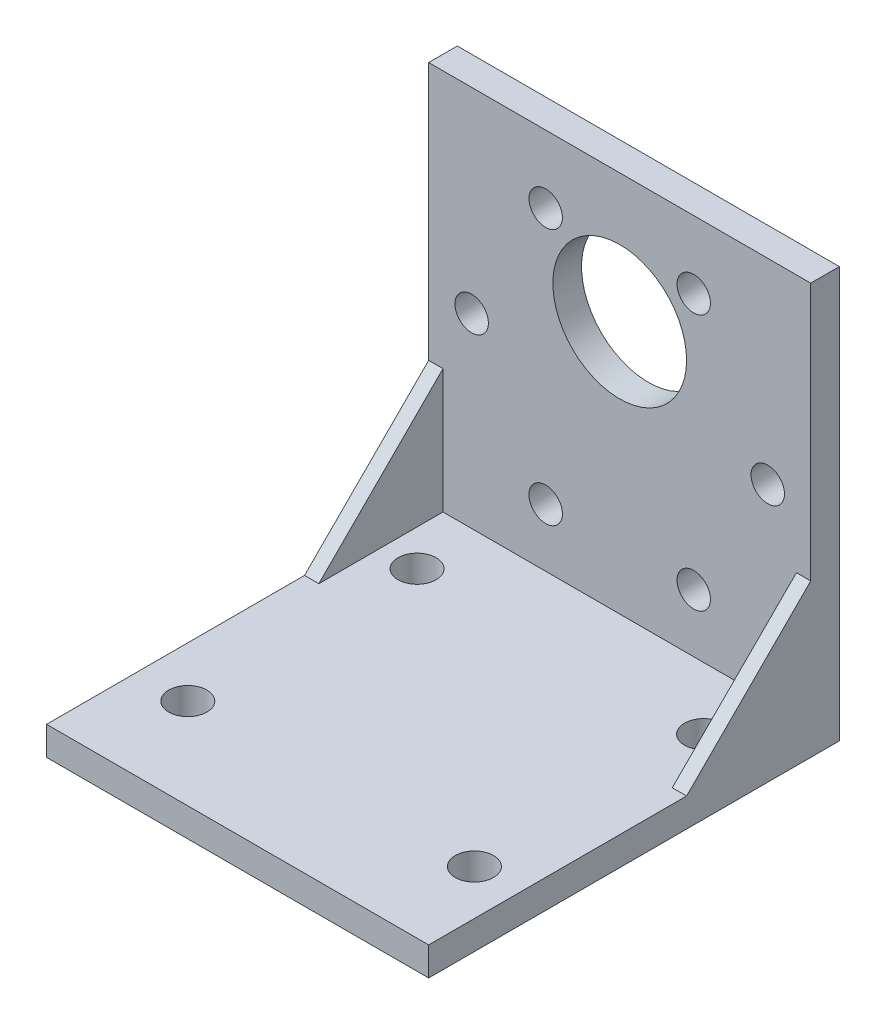
ISO-10303-21;
HEADER;
FILE_DESCRIPTION(('STEP AP214'),'2;1');
FILE_NAME('part.step','',(''),(''),'','','');
FILE_SCHEMA(('AUTOMOTIVE_DESIGN { 1 0 10303 214 1 1 1 1 }'));
ENDSEC;
DATA;
#1=APPLICATION_CONTEXT('core data for automotive mechanical design processes');
#2=APPLICATION_PROTOCOL_DEFINITION('international standard','automotive_design',2000,#1);
#3=PRODUCT_CONTEXT('',#1,'mechanical');
#4=PRODUCT('Part','Part','',(#3));
#5=PRODUCT_RELATED_PRODUCT_CATEGORY('part','',(#4));
#6=PRODUCT_DEFINITION_FORMATION('','',#4);
#7=PRODUCT_DEFINITION_CONTEXT('part definition',#1,'design');
#8=PRODUCT_DEFINITION('design','',#6,#7);
#9=PRODUCT_DEFINITION_SHAPE('','',#8);
#10=(LENGTH_UNIT() NAMED_UNIT(*) SI_UNIT(.MILLI.,.METRE.));
#11=(NAMED_UNIT(*) PLANE_ANGLE_UNIT() SI_UNIT($,.RADIAN.));
#12=(NAMED_UNIT(*) SI_UNIT($,.STERADIAN.) SOLID_ANGLE_UNIT());
#13=UNCERTAINTY_MEASURE_WITH_UNIT(LENGTH_MEASURE(1.E-05),#10,'distance_accuracy_value','');
#14=(GEOMETRIC_REPRESENTATION_CONTEXT(3) GLOBAL_UNCERTAINTY_ASSIGNED_CONTEXT((#13)) GLOBAL_UNIT_ASSIGNED_CONTEXT((#10,
#11,#12)) REPRESENTATION_CONTEXT('',''));
#15=CARTESIAN_POINT('',(0.,0.,0.));
#16=DIRECTION('',(0.,0.,1.));
#17=DIRECTION('',(1.,0.,0.));
#18=AXIS2_PLACEMENT_3D('',#15,#16,#17);
#19=CARTESIAN_POINT('',(0.,-3.,21.5));
#20=DIRECTION('',(0.,0.,1.));
#21=DIRECTION('',(1.,0.,0.));
#22=AXIS2_PLACEMENT_3D('',#19,#20,#21);
#23=PLANE('',#22);
#24=DIRECTION('',(1.,0.,0.));
#25=VECTOR('',#24,1.);
#26=CARTESIAN_POINT('',(0.,0.,21.5));
#27=LINE('',#26,#25);
#28=CARTESIAN_POINT('',(-20.,0.,21.5));
#29=VERTEX_POINT('',#28);
#30=CARTESIAN_POINT('',(20.,0.,21.5));
#31=VERTEX_POINT('',#30);
#32=EDGE_CURVE('E239',#29,#31,#27,.T.);
#33=ORIENTED_EDGE('',*,*,#32,.F.);
#34=DIRECTION('',(0.,1.,0.));
#35=VECTOR('',#34,1.);
#36=CARTESIAN_POINT('',(-20.,-3.,21.5));
#37=LINE('',#36,#35);
#38=CARTESIAN_POINT('',(-20.,-3.,21.5));
#39=VERTEX_POINT('',#38);
#40=EDGE_CURVE('E11',#39,#29,#37,.T.);
#41=ORIENTED_EDGE('',*,*,#40,.F.);
#42=DIRECTION('',(1.,0.,0.));
#43=VECTOR('',#42,1.);
#44=CARTESIAN_POINT('',(0.,-3.,21.5));
#45=LINE('',#44,#43);
#46=CARTESIAN_POINT('',(20.,-3.,21.5));
#47=VERTEX_POINT('',#46);
#48=EDGE_CURVE('E217',#39,#47,#45,.T.);
#49=ORIENTED_EDGE('',*,*,#48,.T.);
#50=DIRECTION('',(0.,1.,0.));
#51=VECTOR('',#50,1.);
#52=CARTESIAN_POINT('',(20.,-3.,21.5));
#53=LINE('',#52,#51);
#54=EDGE_CURVE('E39',#47,#31,#53,.T.);
#55=ORIENTED_EDGE('',*,*,#54,.T.);
#56=EDGE_LOOP('',(#33,#41,#49,#55));
#57=FACE_BOUND('',#56,.T.);
#58=ADVANCED_FACE('F35',(#57),#23,.T.);
#59=CARTESIAN_POINT('',(-20.,-3.,0.));
#60=DIRECTION('',(1.,0.,0.));
#61=DIRECTION('',(0.,0.,-1.));
#62=AXIS2_PLACEMENT_3D('',#59,#60,#61);
#63=PLANE('',#62);
#64=DIRECTION('',(0.,0.,-1.));
#65=VECTOR('',#64,1.);
#66=CARTESIAN_POINT('',(-20.,0.,0.));
#67=LINE('',#66,#65);
#68=CARTESIAN_POINT('',(-20.,0.,-5.5));
#69=VERTEX_POINT('',#68);
#70=EDGE_CURVE('E208',#29,#69,#67,.T.);
#71=ORIENTED_EDGE('',*,*,#70,.T.);
#72=DIRECTION('',(0.,0.707106781186548,-0.707106781186547));
#73=VECTOR('',#72,1.);
#74=CARTESIAN_POINT('',(-20.,13.,-18.5));
#75=LINE('',#74,#73);
#76=CARTESIAN_POINT('',(-20.,13.,-18.5));
#77=VERTEX_POINT('',#76);
#78=EDGE_CURVE('E260',#69,#77,#75,.T.);
#79=ORIENTED_EDGE('',*,*,#78,.T.);
#80=DIRECTION('',(0.,-1.,0.));
#81=VECTOR('',#80,1.);
#82=CARTESIAN_POINT('',(-20.,40.,-18.5));
#83=LINE('',#82,#81);
#84=CARTESIAN_POINT('',(-20.,40.,-18.5));
#85=VERTEX_POINT('',#84);
#86=EDGE_CURVE('E201',#85,#77,#83,.T.);
#87=ORIENTED_EDGE('',*,*,#86,.F.);
#88=DIRECTION('',(0.,0.,1.));
#89=VECTOR('',#88,1.);
#90=CARTESIAN_POINT('',(-20.,40.,0.));
#91=LINE('',#90,#89);
#92=CARTESIAN_POINT('',(-20.,40.,-21.5));
#93=VERTEX_POINT('',#92);
#94=EDGE_CURVE('E120',#93,#85,#91,.T.);
#95=ORIENTED_EDGE('',*,*,#94,.F.);
#96=DIRECTION('',(0.,1.,0.));
#97=VECTOR('',#96,1.);
#98=CARTESIAN_POINT('',(-20.,-3.,-21.5));
#99=LINE('',#98,#97);
#100=CARTESIAN_POINT('',(-20.,-3.,-21.5));
#101=VERTEX_POINT('',#100);
#102=EDGE_CURVE('E44',#101,#93,#99,.T.);
#103=ORIENTED_EDGE('',*,*,#102,.F.);
#104=DIRECTION('',(0.,0.,-1.));
#105=VECTOR('',#104,1.);
#106=CARTESIAN_POINT('',(-20.,-3.,0.));
#107=LINE('',#106,#105);
#108=EDGE_CURVE('E225',#39,#101,#107,.T.);
#109=ORIENTED_EDGE('',*,*,#108,.F.);
#110=ORIENTED_EDGE('',*,*,#40,.T.);
#111=EDGE_LOOP('',(#71,#79,#87,#95,#103,#109,#110));
#112=FACE_BOUND('',#111,.T.);
#113=ADVANCED_FACE('F258',(#112),#63,.F.);
#114=CARTESIAN_POINT('',(0.,-3.,-21.5));
#115=DIRECTION('',(0.,0.,1.));
#116=DIRECTION('',(1.,0.,0.));
#117=AXIS2_PLACEMENT_3D('',#114,#115,#116);
#118=PLANE('',#117);
#119=CARTESIAN_POINT('',(-7.74999999999997,6.0766062413414,-21.5));
#120=DIRECTION('',(0.,0.,1.));
#121=DIRECTION('',(1.,0.,0.));
#122=AXIS2_PLACEMENT_3D('',#119,#120,#121);
#123=CIRCLE('',#122,1.75);
#124=CARTESIAN_POINT('',(-5.99999999999997,6.0766062413414,-21.5));
#125=VERTEX_POINT('',#124);
#126=EDGE_CURVE('E180',#125,#125,#123,.T.);
#127=ORIENTED_EDGE('',*,*,#126,.T.);
#128=EDGE_LOOP('',(#127));
#129=FACE_BOUND('',#128,.T.);
#130=CARTESIAN_POINT('',(-15.5,19.5,-21.5));
#131=DIRECTION('',(0.,0.,1.));
#132=DIRECTION('',(1.,0.,0.));
#133=AXIS2_PLACEMENT_3D('',#130,#131,#132);
#134=CIRCLE('',#133,1.75);
#135=CARTESIAN_POINT('',(-13.75,19.5,-21.5));
#136=VERTEX_POINT('',#135);
#137=EDGE_CURVE('E177',#136,#136,#134,.T.);
#138=ORIENTED_EDGE('',*,*,#137,.T.);
#139=EDGE_LOOP('',(#138));
#140=FACE_BOUND('',#139,.T.);
#141=CARTESIAN_POINT('',(-7.75000000000015,32.9233937586589,-21.5));
#142=DIRECTION('',(0.,0.,1.));
#143=DIRECTION('',(1.,0.,0.));
#144=AXIS2_PLACEMENT_3D('',#141,#142,#143);
#145=CIRCLE('',#144,1.75);
#146=CARTESIAN_POINT('',(-6.00000000000015,32.9233937586589,-21.5));
#147=VERTEX_POINT('',#146);
#148=EDGE_CURVE('E174',#147,#147,#145,.T.);
#149=ORIENTED_EDGE('',*,*,#148,.T.);
#150=EDGE_LOOP('',(#149));
#151=FACE_BOUND('',#150,.T.);
#152=CARTESIAN_POINT('',(7.74999999999988,32.9233937586591,-21.5));
#153=DIRECTION('',(0.,0.,1.));
#154=DIRECTION('',(1.,0.,0.));
#155=AXIS2_PLACEMENT_3D('',#152,#153,#154);
#156=CIRCLE('',#155,1.75);
#157=CARTESIAN_POINT('',(9.49999999999988,32.9233937586591,-21.5));
#158=VERTEX_POINT('',#157);
#159=EDGE_CURVE('E171',#158,#158,#156,.T.);
#160=ORIENTED_EDGE('',*,*,#159,.T.);
#161=EDGE_LOOP('',(#160));
#162=FACE_BOUND('',#161,.T.);
#163=CARTESIAN_POINT('',(15.5,19.5000000000003,-21.5));
#164=DIRECTION('',(0.,0.,1.));
#165=DIRECTION('',(1.,0.,0.));
#166=AXIS2_PLACEMENT_3D('',#163,#164,#165);
#167=CIRCLE('',#166,1.75);
#168=CARTESIAN_POINT('',(17.25,19.5000000000003,-21.5));
#169=VERTEX_POINT('',#168);
#170=EDGE_CURVE('E168',#169,#169,#167,.T.);
#171=ORIENTED_EDGE('',*,*,#170,.T.);
#172=EDGE_LOOP('',(#171));
#173=FACE_BOUND('',#172,.T.);
#174=CARTESIAN_POINT('',(7.75000000000007,6.07660624134145,-21.5));
#175=DIRECTION('',(0.,0.,1.));
#176=DIRECTION('',(1.,0.,0.));
#177=AXIS2_PLACEMENT_3D('',#174,#175,#176);
#178=CIRCLE('',#177,1.75);
#179=CARTESIAN_POINT('',(9.50000000000007,6.07660624134145,-21.5));
#180=VERTEX_POINT('',#179);
#181=EDGE_CURVE('E165',#180,#180,#178,.T.);
#182=ORIENTED_EDGE('',*,*,#181,.T.);
#183=EDGE_LOOP('',(#182));
#184=FACE_BOUND('',#183,.T.);
#185=CARTESIAN_POINT('',(0.,26.5,-21.5));
#186=DIRECTION('',(0.,0.,1.));
#187=DIRECTION('',(1.,0.,0.));
#188=AXIS2_PLACEMENT_3D('',#185,#186,#187);
#189=CIRCLE('',#188,7.);
#190=CARTESIAN_POINT('',(7.,26.5,-21.5));
#191=VERTEX_POINT('',#190);
#192=EDGE_CURVE('E121',#191,#191,#189,.T.);
#193=ORIENTED_EDGE('',*,*,#192,.T.);
#194=EDGE_LOOP('',(#193));
#195=FACE_BOUND('',#194,.T.);
#196=ORIENTED_EDGE('',*,*,#102,.T.);
#197=DIRECTION('',(-1.,0.,0.));
#198=VECTOR('',#197,1.);
#199=CARTESIAN_POINT('',(0.,40.,-21.5));
#200=LINE('',#199,#198);
#201=CARTESIAN_POINT('',(20.,40.,-21.5));
#202=VERTEX_POINT('',#201);
#203=EDGE_CURVE('E195',#202,#93,#200,.T.);
#204=ORIENTED_EDGE('',*,*,#203,.F.);
#205=DIRECTION('',(0.,1.,0.));
#206=VECTOR('',#205,1.);
#207=CARTESIAN_POINT('',(20.,-3.,-21.5));
#208=LINE('',#207,#206);
#209=CARTESIAN_POINT('',(20.,-3.,-21.5));
#210=VERTEX_POINT('',#209);
#211=EDGE_CURVE('E245',#210,#202,#208,.T.);
#212=ORIENTED_EDGE('',*,*,#211,.F.);
#213=DIRECTION('',(1.,0.,0.));
#214=VECTOR('',#213,1.);
#215=CARTESIAN_POINT('',(0.,-3.,-21.5));
#216=LINE('',#215,#214);
#217=EDGE_CURVE('E223',#101,#210,#216,.T.);
#218=ORIENTED_EDGE('',*,*,#217,.F.);
#219=EDGE_LOOP('',(#196,#204,#212,#218));
#220=FACE_BOUND('',#219,.T.);
#221=ADVANCED_FACE('F285',(#129,#140,#151,#162,#173,#184,#195,#220),#118,.F.);
#222=CARTESIAN_POINT('',(-14.7150530034863,-3.,-12.));
#223=DIRECTION('',(0.,1.,0.));
#224=DIRECTION('',(0.,0.,1.));
#225=AXIS2_PLACEMENT_3D('',#222,#223,#224);
#226=CYLINDRICAL_SURFACE('',#225,2.);
#227=CARTESIAN_POINT('',(-14.7150530034863,-3.,-12.));
#228=DIRECTION('',(0.,1.,0.));
#229=DIRECTION('',(0.,0.,1.));
#230=AXIS2_PLACEMENT_3D('',#227,#228,#229);
#231=CIRCLE('',#230,2.);
#232=CARTESIAN_POINT('',(-14.7150530034863,-3.,-10.));
#233=VERTEX_POINT('',#232);
#234=EDGE_CURVE('E214',#233,#233,#231,.T.);
#235=ORIENTED_EDGE('',*,*,#234,.F.);
#236=EDGE_LOOP('',(#235));
#237=FACE_BOUND('',#236,.T.);
#238=CARTESIAN_POINT('',(-14.7150530034863,0.,-12.));
#239=DIRECTION('',(0.,1.,0.));
#240=DIRECTION('',(0.,0.,1.));
#241=AXIS2_PLACEMENT_3D('',#238,#239,#240);
#242=CIRCLE('',#241,2.);
#243=CARTESIAN_POINT('',(-14.7150530034863,0.,-10.));
#244=VERTEX_POINT('',#243);
#245=EDGE_CURVE('E236',#244,#244,#242,.T.);
#246=ORIENTED_EDGE('',*,*,#245,.T.);
#247=EDGE_LOOP('',(#246));
#248=FACE_BOUND('',#247,.T.);
#249=ADVANCED_FACE('F290',(#237,#248),#226,.F.);
#250=CARTESIAN_POINT('',(15.2849469965137,-3.,-12.));
#251=DIRECTION('',(0.,1.,0.));
#252=DIRECTION('',(0.,0.,1.));
#253=AXIS2_PLACEMENT_3D('',#250,#251,#252);
#254=CYLINDRICAL_SURFACE('',#253,2.);
#255=CARTESIAN_POINT('',(15.2849469965137,-3.,-12.));
#256=DIRECTION('',(0.,1.,0.));
#257=DIRECTION('',(0.,0.,1.));
#258=AXIS2_PLACEMENT_3D('',#255,#256,#257);
#259=CIRCLE('',#258,2.);
#260=CARTESIAN_POINT('',(15.2849469965137,-3.,-9.99999999999999));
#261=VERTEX_POINT('',#260);
#262=EDGE_CURVE('E211',#261,#261,#259,.T.);
#263=ORIENTED_EDGE('',*,*,#262,.F.);
#264=EDGE_LOOP('',(#263));
#265=FACE_BOUND('',#264,.T.);
#266=CARTESIAN_POINT('',(15.2849469965137,0.,-12.));
#267=DIRECTION('',(0.,1.,0.));
#268=DIRECTION('',(0.,0.,1.));
#269=AXIS2_PLACEMENT_3D('',#266,#267,#268);
#270=CIRCLE('',#269,2.);
#271=CARTESIAN_POINT('',(15.2849469965137,0.,-9.99999999999999));
#272=VERTEX_POINT('',#271);
#273=EDGE_CURVE('E233',#272,#272,#270,.T.);
#274=ORIENTED_EDGE('',*,*,#273,.T.);
#275=EDGE_LOOP('',(#274));
#276=FACE_BOUND('',#275,.T.);
#277=ADVANCED_FACE('F293',(#265,#276),#254,.F.);
#278=CARTESIAN_POINT('',(-14.7150530034863,-3.,12.));
#279=DIRECTION('',(0.,1.,0.));
#280=DIRECTION('',(0.,0.,1.));
#281=AXIS2_PLACEMENT_3D('',#278,#279,#280);
#282=CYLINDRICAL_SURFACE('',#281,2.);
#283=CARTESIAN_POINT('',(-14.7150530034863,-3.,12.));
#284=DIRECTION('',(0.,1.,0.));
#285=DIRECTION('',(0.,0.,1.));
#286=AXIS2_PLACEMENT_3D('',#283,#284,#285);
#287=CIRCLE('',#286,2.);
#288=CARTESIAN_POINT('',(-14.7150530034863,-3.,14.));
#289=VERTEX_POINT('',#288);
#290=EDGE_CURVE('E207',#289,#289,#287,.T.);
#291=ORIENTED_EDGE('',*,*,#290,.F.);
#292=EDGE_LOOP('',(#291));
#293=FACE_BOUND('',#292,.T.);
#294=CARTESIAN_POINT('',(-14.7150530034863,0.,12.));
#295=DIRECTION('',(0.,1.,0.));
#296=DIRECTION('',(0.,0.,1.));
#297=AXIS2_PLACEMENT_3D('',#294,#295,#296);
#298=CIRCLE('',#297,2.);
#299=CARTESIAN_POINT('',(-14.7150530034863,0.,14.));
#300=VERTEX_POINT('',#299);
#301=EDGE_CURVE('E230',#300,#300,#298,.T.);
#302=ORIENTED_EDGE('',*,*,#301,.T.);
#303=EDGE_LOOP('',(#302));
#304=FACE_BOUND('',#303,.T.);
#305=ADVANCED_FACE('F296',(#293,#304),#282,.F.);
#306=CARTESIAN_POINT('',(15.2849469965137,-3.,12.));
#307=DIRECTION('',(0.,1.,0.));
#308=DIRECTION('',(0.,0.,1.));
#309=AXIS2_PLACEMENT_3D('',#306,#307,#308);
#310=CYLINDRICAL_SURFACE('',#309,2.);
#311=CARTESIAN_POINT('',(15.2849469965137,-3.,12.));
#312=DIRECTION('',(0.,1.,0.));
#313=DIRECTION('',(0.,0.,1.));
#314=AXIS2_PLACEMENT_3D('',#311,#312,#313);
#315=CIRCLE('',#314,2.);
#316=CARTESIAN_POINT('',(15.2849469965137,-3.,14.));
#317=VERTEX_POINT('',#316);
#318=EDGE_CURVE('E204',#317,#317,#315,.T.);
#319=ORIENTED_EDGE('',*,*,#318,.F.);
#320=EDGE_LOOP('',(#319));
#321=FACE_BOUND('',#320,.T.);
#322=CARTESIAN_POINT('',(15.2849469965137,0.,12.));
#323=DIRECTION('',(0.,1.,0.));
#324=DIRECTION('',(0.,0.,1.));
#325=AXIS2_PLACEMENT_3D('',#322,#323,#324);
#326=CIRCLE('',#325,2.);
#327=CARTESIAN_POINT('',(15.2849469965137,0.,14.));
#328=VERTEX_POINT('',#327);
#329=EDGE_CURVE('E203',#328,#328,#326,.T.);
#330=ORIENTED_EDGE('',*,*,#329,.T.);
#331=EDGE_LOOP('',(#330));
#332=FACE_BOUND('',#331,.T.);
#333=ADVANCED_FACE('F37',(#321,#332),#310,.F.);
#334=CARTESIAN_POINT('',(20.,-3.,0.));
#335=DIRECTION('',(1.,0.,0.));
#336=DIRECTION('',(0.,0.,-1.));
#337=AXIS2_PLACEMENT_3D('',#334,#335,#336);
#338=PLANE('',#337);
#339=DIRECTION('',(0.,0.,-1.));
#340=VECTOR('',#339,1.);
#341=CARTESIAN_POINT('',(20.,0.,0.));
#342=LINE('',#341,#340);
#343=CARTESIAN_POINT('',(20.,0.,-5.5));
#344=VERTEX_POINT('',#343);
#345=EDGE_CURVE('E242',#31,#344,#342,.T.);
#346=ORIENTED_EDGE('',*,*,#345,.F.);
#347=ORIENTED_EDGE('',*,*,#54,.F.);
#348=DIRECTION('',(0.,0.,-1.));
#349=VECTOR('',#348,1.);
#350=CARTESIAN_POINT('',(20.,-3.,0.));
#351=LINE('',#350,#349);
#352=EDGE_CURVE('E220',#47,#210,#351,.T.);
#353=ORIENTED_EDGE('',*,*,#352,.T.);
#354=ORIENTED_EDGE('',*,*,#211,.T.);
#355=DIRECTION('',(0.,0.,-1.));
#356=VECTOR('',#355,1.);
#357=CARTESIAN_POINT('',(20.,40.,0.));
#358=LINE('',#357,#356);
#359=CARTESIAN_POINT('',(20.,40.,-18.5));
#360=VERTEX_POINT('',#359);
#361=EDGE_CURVE('E192',#360,#202,#358,.T.);
#362=ORIENTED_EDGE('',*,*,#361,.F.);
#363=DIRECTION('',(0.,-1.,0.));
#364=VECTOR('',#363,1.);
#365=CARTESIAN_POINT('',(20.,40.,-18.5));
#366=LINE('',#365,#364);
#367=CARTESIAN_POINT('',(20.,13.,-18.5));
#368=VERTEX_POINT('',#367);
#369=EDGE_CURVE('E197',#360,#368,#366,.T.);
#370=ORIENTED_EDGE('',*,*,#369,.T.);
#371=DIRECTION('',(0.,-0.707106781186548,0.707106781186547));
#372=VECTOR('',#371,1.);
#373=CARTESIAN_POINT('',(20.,13.,-18.5));
#374=LINE('',#373,#372);
#375=EDGE_CURVE('E135',#368,#344,#374,.T.);
#376=ORIENTED_EDGE('',*,*,#375,.T.);
#377=EDGE_LOOP('',(#346,#347,#353,#354,#362,#370,#376));
#378=FACE_BOUND('',#377,.T.);
#379=ADVANCED_FACE('F254',(#378),#338,.T.);
#380=CARTESIAN_POINT('',(0.,-3.,0.));
#381=DIRECTION('',(0.,1.,0.));
#382=DIRECTION('',(0.,0.,1.));
#383=AXIS2_PLACEMENT_3D('',#380,#381,#382);
#384=PLANE('',#383);
#385=ORIENTED_EDGE('',*,*,#318,.T.);
#386=EDGE_LOOP('',(#385));
#387=FACE_BOUND('',#386,.T.);
#388=ORIENTED_EDGE('',*,*,#290,.T.);
#389=EDGE_LOOP('',(#388));
#390=FACE_BOUND('',#389,.T.);
#391=ORIENTED_EDGE('',*,*,#262,.T.);
#392=EDGE_LOOP('',(#391));
#393=FACE_BOUND('',#392,.T.);
#394=ORIENTED_EDGE('',*,*,#234,.T.);
#395=EDGE_LOOP('',(#394));
#396=FACE_BOUND('',#395,.T.);
#397=ORIENTED_EDGE('',*,*,#48,.F.);
#398=ORIENTED_EDGE('',*,*,#108,.T.);
#399=ORIENTED_EDGE('',*,*,#217,.T.);
#400=ORIENTED_EDGE('',*,*,#352,.F.);
#401=EDGE_LOOP('',(#397,#398,#399,#400));
#402=FACE_BOUND('',#401,.T.);
#403=ADVANCED_FACE('F310',(#387,#390,#393,#396,#402),#384,.F.);
#404=CARTESIAN_POINT('',(0.,0.,0.));
#405=DIRECTION('',(0.,1.,0.));
#406=DIRECTION('',(0.,0.,1.));
#407=AXIS2_PLACEMENT_3D('',#404,#405,#406);
#408=PLANE('',#407);
#409=DIRECTION('',(-1.,0.,0.));
#410=VECTOR('',#409,1.);
#411=CARTESIAN_POINT('',(-18.5,0.,-5.5));
#412=LINE('',#411,#410);
#413=CARTESIAN_POINT('',(-18.5,0.,-5.5));
#414=VERTEX_POINT('',#413);
#415=EDGE_CURVE('E56',#414,#69,#412,.T.);
#416=ORIENTED_EDGE('',*,*,#415,.T.);
#417=ORIENTED_EDGE('',*,*,#70,.F.);
#418=ORIENTED_EDGE('',*,*,#32,.T.);
#419=ORIENTED_EDGE('',*,*,#345,.T.);
#420=DIRECTION('',(1.,0.,0.));
#421=VECTOR('',#420,1.);
#422=CARTESIAN_POINT('',(18.5,0.,-5.5));
#423=LINE('',#422,#421);
#424=CARTESIAN_POINT('',(18.5,0.,-5.5));
#425=VERTEX_POINT('',#424);
#426=EDGE_CURVE('E134',#425,#344,#423,.T.);
#427=ORIENTED_EDGE('',*,*,#426,.F.);
#428=DIRECTION('',(0.,0.,-1.));
#429=VECTOR('',#428,1.);
#430=CARTESIAN_POINT('',(18.5,0.,-18.5));
#431=LINE('',#430,#429);
#432=CARTESIAN_POINT('',(18.5,0.,-18.5));
#433=VERTEX_POINT('',#432);
#434=EDGE_CURVE('E126',#425,#433,#431,.T.);
#435=ORIENTED_EDGE('',*,*,#434,.T.);
#436=DIRECTION('',(1.,0.,0.));
#437=VECTOR('',#436,1.);
#438=CARTESIAN_POINT('',(0.,0.,-18.5));
#439=LINE('',#438,#437);
#440=CARTESIAN_POINT('',(-18.5,0.,-18.5));
#441=VERTEX_POINT('',#440);
#442=EDGE_CURVE('E112',#441,#433,#439,.T.);
#443=ORIENTED_EDGE('',*,*,#442,.F.);
#444=DIRECTION('',(0.,0.,1.));
#445=VECTOR('',#444,1.);
#446=CARTESIAN_POINT('',(-18.5,0.,-5.5));
#447=LINE('',#446,#445);
#448=EDGE_CURVE('E52',#441,#414,#447,.T.);
#449=ORIENTED_EDGE('',*,*,#448,.T.);
#450=EDGE_LOOP('',(#416,#417,#418,#419,#427,#435,#443,#449));
#451=FACE_BOUND('',#450,.T.);
#452=ORIENTED_EDGE('',*,*,#329,.F.);
#453=EDGE_LOOP('',(#452));
#454=FACE_BOUND('',#453,.T.);
#455=ORIENTED_EDGE('',*,*,#301,.F.);
#456=EDGE_LOOP('',(#455));
#457=FACE_BOUND('',#456,.T.);
#458=ORIENTED_EDGE('',*,*,#273,.F.);
#459=EDGE_LOOP('',(#458));
#460=FACE_BOUND('',#459,.T.);
#461=ORIENTED_EDGE('',*,*,#245,.F.);
#462=EDGE_LOOP('',(#461));
#463=FACE_BOUND('',#462,.T.);
#464=ADVANCED_FACE('F131',(#451,#454,#457,#460,#463),#408,.T.);
#465=CARTESIAN_POINT('',(0.,40.,-18.5));
#466=DIRECTION('',(0.,0.,-1.));
#467=DIRECTION('',(-1.,0.,0.));
#468=AXIS2_PLACEMENT_3D('',#465,#466,#467);
#469=PLANE('',#468);
#470=CARTESIAN_POINT('',(-7.74999999999997,6.0766062413414,-18.5));
#471=DIRECTION('',(0.,0.,1.));
#472=DIRECTION('',(1.,0.,0.));
#473=AXIS2_PLACEMENT_3D('',#470,#471,#472);
#474=CIRCLE('',#473,1.75);
#475=CARTESIAN_POINT('',(-5.99999999999997,6.0766062413414,-18.5));
#476=VERTEX_POINT('',#475);
#477=EDGE_CURVE('E146',#476,#476,#474,.T.);
#478=ORIENTED_EDGE('',*,*,#477,.F.);
#479=EDGE_LOOP('',(#478));
#480=FACE_BOUND('',#479,.T.);
#481=CARTESIAN_POINT('',(-15.5,19.5,-18.5));
#482=DIRECTION('',(0.,0.,1.));
#483=DIRECTION('',(1.,0.,0.));
#484=AXIS2_PLACEMENT_3D('',#481,#482,#483);
#485=CIRCLE('',#484,1.75);
#486=CARTESIAN_POINT('',(-13.75,19.5,-18.5));
#487=VERTEX_POINT('',#486);
#488=EDGE_CURVE('E158',#487,#487,#485,.T.);
#489=ORIENTED_EDGE('',*,*,#488,.F.);
#490=EDGE_LOOP('',(#489));
#491=FACE_BOUND('',#490,.T.);
#492=CARTESIAN_POINT('',(-7.75000000000015,32.9233937586589,-18.5));
#493=DIRECTION('',(0.,0.,1.));
#494=DIRECTION('',(1.,0.,0.));
#495=AXIS2_PLACEMENT_3D('',#492,#493,#494);
#496=CIRCLE('',#495,1.75);
#497=CARTESIAN_POINT('',(-6.00000000000015,32.9233937586589,-18.5));
#498=VERTEX_POINT('',#497);
#499=EDGE_CURVE('E155',#498,#498,#496,.T.);
#500=ORIENTED_EDGE('',*,*,#499,.F.);
#501=EDGE_LOOP('',(#500));
#502=FACE_BOUND('',#501,.T.);
#503=CARTESIAN_POINT('',(7.74999999999988,32.9233937586591,-18.5));
#504=DIRECTION('',(0.,0.,1.));
#505=DIRECTION('',(1.,0.,0.));
#506=AXIS2_PLACEMENT_3D('',#503,#504,#505);
#507=CIRCLE('',#506,1.75);
#508=CARTESIAN_POINT('',(9.49999999999988,32.9233937586591,-18.5));
#509=VERTEX_POINT('',#508);
#510=EDGE_CURVE('E152',#509,#509,#507,.T.);
#511=ORIENTED_EDGE('',*,*,#510,.F.);
#512=EDGE_LOOP('',(#511));
#513=FACE_BOUND('',#512,.T.);
#514=CARTESIAN_POINT('',(15.5,19.5000000000003,-18.5));
#515=DIRECTION('',(0.,0.,1.));
#516=DIRECTION('',(1.,0.,0.));
#517=AXIS2_PLACEMENT_3D('',#514,#515,#516);
#518=CIRCLE('',#517,1.75);
#519=CARTESIAN_POINT('',(17.25,19.5000000000003,-18.5));
#520=VERTEX_POINT('',#519);
#521=EDGE_CURVE('E148',#520,#520,#518,.T.);
#522=ORIENTED_EDGE('',*,*,#521,.F.);
#523=EDGE_LOOP('',(#522));
#524=FACE_BOUND('',#523,.T.);
#525=CARTESIAN_POINT('',(7.75000000000007,6.07660624134145,-18.5));
#526=DIRECTION('',(0.,0.,1.));
#527=DIRECTION('',(1.,0.,0.));
#528=AXIS2_PLACEMENT_3D('',#525,#526,#527);
#529=CIRCLE('',#528,1.75);
#530=CARTESIAN_POINT('',(9.50000000000007,6.07660624134145,-18.5));
#531=VERTEX_POINT('',#530);
#532=EDGE_CURVE('E151',#531,#531,#529,.T.);
#533=ORIENTED_EDGE('',*,*,#532,.F.);
#534=EDGE_LOOP('',(#533));
#535=FACE_BOUND('',#534,.T.);
#536=CARTESIAN_POINT('',(0.,26.5,-18.5));
#537=DIRECTION('',(0.,0.,1.));
#538=DIRECTION('',(1.,0.,0.));
#539=AXIS2_PLACEMENT_3D('',#536,#537,#538);
#540=CIRCLE('',#539,7.);
#541=CARTESIAN_POINT('',(7.,26.5,-18.5));
#542=VERTEX_POINT('',#541);
#543=EDGE_CURVE('E183',#542,#542,#540,.T.);
#544=ORIENTED_EDGE('',*,*,#543,.F.);
#545=EDGE_LOOP('',(#544));
#546=FACE_BOUND('',#545,.T.);
#547=ORIENTED_EDGE('',*,*,#86,.T.);
#548=DIRECTION('',(-1.,0.,0.));
#549=VECTOR('',#548,1.);
#550=CARTESIAN_POINT('',(-18.5,13.,-18.5));
#551=LINE('',#550,#549);
#552=CARTESIAN_POINT('',(-18.5,13.,-18.5));
#553=VERTEX_POINT('',#552);
#554=EDGE_CURVE('E138',#553,#77,#551,.T.);
#555=ORIENTED_EDGE('',*,*,#554,.F.);
#556=DIRECTION('',(0.,-1.,0.));
#557=VECTOR('',#556,1.);
#558=CARTESIAN_POINT('',(-18.5,0.,-18.5));
#559=LINE('',#558,#557);
#560=EDGE_CURVE('E118',#553,#441,#559,.T.);
#561=ORIENTED_EDGE('',*,*,#560,.T.);
#562=ORIENTED_EDGE('',*,*,#442,.T.);
#563=DIRECTION('',(0.,1.,0.));
#564=VECTOR('',#563,1.);
#565=CARTESIAN_POINT('',(18.5,0.,-18.5));
#566=LINE('',#565,#564);
#567=CARTESIAN_POINT('',(18.5,13.,-18.5));
#568=VERTEX_POINT('',#567);
#569=EDGE_CURVE('E116',#433,#568,#566,.T.);
#570=ORIENTED_EDGE('',*,*,#569,.T.);
#571=DIRECTION('',(1.,0.,0.));
#572=VECTOR('',#571,1.);
#573=CARTESIAN_POINT('',(18.5,13.,-18.5));
#574=LINE('',#573,#572);
#575=EDGE_CURVE('E143',#568,#368,#574,.T.);
#576=ORIENTED_EDGE('',*,*,#575,.T.);
#577=ORIENTED_EDGE('',*,*,#369,.F.);
#578=DIRECTION('',(1.,0.,0.));
#579=VECTOR('',#578,1.);
#580=CARTESIAN_POINT('',(0.,40.,-18.5));
#581=LINE('',#580,#579);
#582=EDGE_CURVE('E190',#85,#360,#581,.T.);
#583=ORIENTED_EDGE('',*,*,#582,.F.);
#584=EDGE_LOOP('',(#547,#555,#561,#562,#570,#576,#577,#583));
#585=FACE_BOUND('',#584,.T.);
#586=ADVANCED_FACE('F114',(#480,#491,#502,#513,#524,#535,#546,#585),#469,.F.);
#587=CARTESIAN_POINT('',(0.,40.,0.));
#588=DIRECTION('',(0.,1.,0.));
#589=DIRECTION('',(0.,0.,1.));
#590=AXIS2_PLACEMENT_3D('',#587,#588,#589);
#591=PLANE('',#590);
#592=ORIENTED_EDGE('',*,*,#94,.T.);
#593=ORIENTED_EDGE('',*,*,#582,.T.);
#594=ORIENTED_EDGE('',*,*,#361,.T.);
#595=ORIENTED_EDGE('',*,*,#203,.T.);
#596=EDGE_LOOP('',(#592,#593,#594,#595));
#597=FACE_BOUND('',#596,.T.);
#598=ADVANCED_FACE('F321',(#597),#591,.T.);
#599=CARTESIAN_POINT('',(0.,26.5,-52.5));
#600=DIRECTION('',(0.,0.,1.));
#601=DIRECTION('',(1.,0.,0.));
#602=AXIS2_PLACEMENT_3D('',#599,#600,#601);
#603=CYLINDRICAL_SURFACE('',#602,7.);
#604=ORIENTED_EDGE('',*,*,#543,.T.);
#605=EDGE_LOOP('',(#604));
#606=FACE_BOUND('',#605,.T.);
#607=ORIENTED_EDGE('',*,*,#192,.F.);
#608=EDGE_LOOP('',(#607));
#609=FACE_BOUND('',#608,.T.);
#610=ADVANCED_FACE('F381',(#606,#609),#603,.F.);
#611=CARTESIAN_POINT('',(7.75000000000007,6.07660624134145,-28.5));
#612=DIRECTION('',(0.,0.,1.));
#613=DIRECTION('',(1.,0.,0.));
#614=AXIS2_PLACEMENT_3D('',#611,#612,#613);
#615=CYLINDRICAL_SURFACE('',#614,1.75);
#616=ORIENTED_EDGE('',*,*,#532,.T.);
#617=EDGE_LOOP('',(#616));
#618=FACE_BOUND('',#617,.T.);
#619=ORIENTED_EDGE('',*,*,#181,.F.);
#620=EDGE_LOOP('',(#619));
#621=FACE_BOUND('',#620,.T.);
#622=ADVANCED_FACE('F367',(#618,#621),#615,.F.);
#623=CARTESIAN_POINT('',(15.5,19.5000000000003,-28.5));
#624=DIRECTION('',(0.,0.,1.));
#625=DIRECTION('',(1.,0.,0.));
#626=AXIS2_PLACEMENT_3D('',#623,#624,#625);
#627=CYLINDRICAL_SURFACE('',#626,1.75);
#628=ORIENTED_EDGE('',*,*,#521,.T.);
#629=EDGE_LOOP('',(#628));
#630=FACE_BOUND('',#629,.T.);
#631=ORIENTED_EDGE('',*,*,#170,.F.);
#632=EDGE_LOOP('',(#631));
#633=FACE_BOUND('',#632,.T.);
#634=ADVANCED_FACE('F363',(#630,#633),#627,.F.);
#635=CARTESIAN_POINT('',(7.74999999999988,32.9233937586591,-28.5));
#636=DIRECTION('',(0.,0.,1.));
#637=DIRECTION('',(1.,0.,0.));
#638=AXIS2_PLACEMENT_3D('',#635,#636,#637);
#639=CYLINDRICAL_SURFACE('',#638,1.75);
#640=ORIENTED_EDGE('',*,*,#510,.T.);
#641=EDGE_LOOP('',(#640));
#642=FACE_BOUND('',#641,.T.);
#643=ORIENTED_EDGE('',*,*,#159,.F.);
#644=EDGE_LOOP('',(#643));
#645=FACE_BOUND('',#644,.T.);
#646=ADVANCED_FACE('F366',(#642,#645),#639,.F.);
#647=CARTESIAN_POINT('',(-7.75000000000015,32.9233937586589,-28.5));
#648=DIRECTION('',(0.,0.,1.));
#649=DIRECTION('',(1.,0.,0.));
#650=AXIS2_PLACEMENT_3D('',#647,#648,#649);
#651=CYLINDRICAL_SURFACE('',#650,1.75);
#652=ORIENTED_EDGE('',*,*,#499,.T.);
#653=EDGE_LOOP('',(#652));
#654=FACE_BOUND('',#653,.T.);
#655=ORIENTED_EDGE('',*,*,#148,.F.);
#656=EDGE_LOOP('',(#655));
#657=FACE_BOUND('',#656,.T.);
#658=ADVANCED_FACE('F371',(#654,#657),#651,.F.);
#659=CARTESIAN_POINT('',(-15.5,19.5,-28.5));
#660=DIRECTION('',(0.,0.,1.));
#661=DIRECTION('',(1.,0.,0.));
#662=AXIS2_PLACEMENT_3D('',#659,#660,#661);
#663=CYLINDRICAL_SURFACE('',#662,1.75);
#664=ORIENTED_EDGE('',*,*,#488,.T.);
#665=EDGE_LOOP('',(#664));
#666=FACE_BOUND('',#665,.T.);
#667=ORIENTED_EDGE('',*,*,#137,.F.);
#668=EDGE_LOOP('',(#667));
#669=FACE_BOUND('',#668,.T.);
#670=ADVANCED_FACE('F359',(#666,#669),#663,.F.);
#671=CARTESIAN_POINT('',(-7.74999999999997,6.0766062413414,-28.5));
#672=DIRECTION('',(0.,0.,1.));
#673=DIRECTION('',(1.,0.,0.));
#674=AXIS2_PLACEMENT_3D('',#671,#672,#673);
#675=CYLINDRICAL_SURFACE('',#674,1.75);
#676=ORIENTED_EDGE('',*,*,#477,.T.);
#677=EDGE_LOOP('',(#676));
#678=FACE_BOUND('',#677,.T.);
#679=ORIENTED_EDGE('',*,*,#126,.F.);
#680=EDGE_LOOP('',(#679));
#681=FACE_BOUND('',#680,.T.);
#682=ADVANCED_FACE('F352',(#678,#681),#675,.F.);
#683=CARTESIAN_POINT('',(18.5,13.,-18.5));
#684=DIRECTION('',(0.,0.707106781186547,0.707106781186548));
#685=DIRECTION('',(0.,-0.707106781186548,0.707106781186547));
#686=AXIS2_PLACEMENT_3D('',#683,#684,#685);
#687=PLANE('',#686);
#688=ORIENTED_EDGE('',*,*,#375,.F.);
#689=ORIENTED_EDGE('',*,*,#575,.F.);
#690=DIRECTION('',(0.,-0.707106781186548,0.707106781186547));
#691=VECTOR('',#690,1.);
#692=CARTESIAN_POINT('',(18.5,13.,-18.5));
#693=LINE('',#692,#691);
#694=EDGE_CURVE('E128',#568,#425,#693,.T.);
#695=ORIENTED_EDGE('',*,*,#694,.T.);
#696=ORIENTED_EDGE('',*,*,#426,.T.);
#697=EDGE_LOOP('',(#688,#689,#695,#696));
#698=FACE_BOUND('',#697,.T.);
#699=ADVANCED_FACE('F350',(#698),#687,.T.);
#700=CARTESIAN_POINT('',(18.5,0.,0.));
#701=DIRECTION('',(-1.,0.,0.));
#702=DIRECTION('',(0.,0.,1.));
#703=AXIS2_PLACEMENT_3D('',#700,#701,#702);
#704=PLANE('',#703);
#705=ORIENTED_EDGE('',*,*,#434,.F.);
#706=ORIENTED_EDGE('',*,*,#694,.F.);
#707=ORIENTED_EDGE('',*,*,#569,.F.);
#708=EDGE_LOOP('',(#705,#706,#707));
#709=FACE_BOUND('',#708,.T.);
#710=ADVANCED_FACE('F125',(#709),#704,.T.);
#711=CARTESIAN_POINT('',(-18.5,13.,-18.5));
#712=DIRECTION('',(0.,0.707106781186547,0.707106781186548));
#713=DIRECTION('',(0.,-0.707106781186548,0.707106781186547));
#714=AXIS2_PLACEMENT_3D('',#711,#712,#713);
#715=PLANE('',#714);
#716=ORIENTED_EDGE('',*,*,#78,.F.);
#717=ORIENTED_EDGE('',*,*,#415,.F.);
#718=DIRECTION('',(0.,0.707106781186548,-0.707106781186547));
#719=VECTOR('',#718,1.);
#720=CARTESIAN_POINT('',(-18.5,13.,-18.5));
#721=LINE('',#720,#719);
#722=EDGE_CURVE('E268',#414,#553,#721,.T.);
#723=ORIENTED_EDGE('',*,*,#722,.T.);
#724=ORIENTED_EDGE('',*,*,#554,.T.);
#725=EDGE_LOOP('',(#716,#717,#723,#724));
#726=FACE_BOUND('',#725,.T.);
#727=ADVANCED_FACE('F264',(#726),#715,.T.);
#728=CARTESIAN_POINT('',(-18.5,0.,0.));
#729=DIRECTION('',(1.,0.,0.));
#730=DIRECTION('',(0.,0.,-1.));
#731=AXIS2_PLACEMENT_3D('',#728,#729,#730);
#732=PLANE('',#731);
#733=ORIENTED_EDGE('',*,*,#448,.F.);
#734=ORIENTED_EDGE('',*,*,#560,.F.);
#735=ORIENTED_EDGE('',*,*,#722,.F.);
#736=EDGE_LOOP('',(#733,#734,#735));
#737=FACE_BOUND('',#736,.T.);
#738=ADVANCED_FACE('F273',(#737),#732,.T.);
#739=CLOSED_SHELL('',(#58,#113,#221,#249,#277,#305,#333,#379,#403,#464,#586,#598,#610,#622,#634,
#646,#658,#670,#682,#699,#710,#727,#738));
#740=MANIFOLD_SOLID_BREP('B2',#739);
#741=ADVANCED_BREP_SHAPE_REPRESENTATION('',(#18,#740),#14);
#742=SHAPE_DEFINITION_REPRESENTATION(#9,#741);
ENDSEC;
END-ISO-10303-21;
